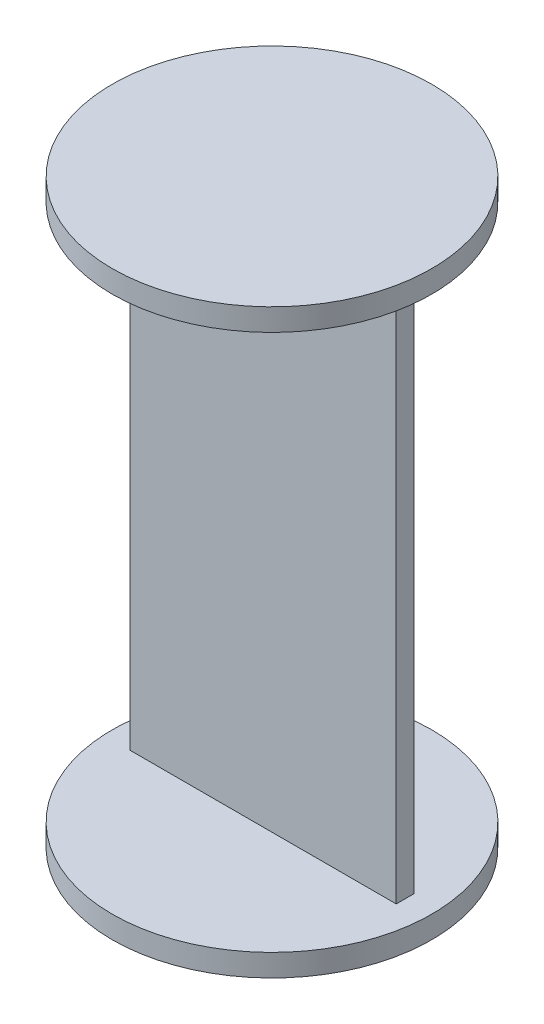
ISO-10303-21;
HEADER;
FILE_DESCRIPTION(('STEP AP214'),'2;1');
FILE_NAME('part.step','',(''),(''),'','','');
FILE_SCHEMA(('AUTOMOTIVE_DESIGN { 1 0 10303 214 1 1 1 1 }'));
ENDSEC;
DATA;
#1=APPLICATION_CONTEXT('core data for automotive mechanical design processes');
#2=APPLICATION_PROTOCOL_DEFINITION('international standard','automotive_design',2000,#1);
#3=PRODUCT_CONTEXT('',#1,'mechanical');
#4=PRODUCT('Part','Part','',(#3));
#5=PRODUCT_RELATED_PRODUCT_CATEGORY('part','',(#4));
#6=PRODUCT_DEFINITION_FORMATION('','',#4);
#7=PRODUCT_DEFINITION_CONTEXT('part definition',#1,'design');
#8=PRODUCT_DEFINITION('design','',#6,#7);
#9=PRODUCT_DEFINITION_SHAPE('','',#8);
#10=(LENGTH_UNIT() NAMED_UNIT(*) SI_UNIT(.MILLI.,.METRE.));
#11=(NAMED_UNIT(*) PLANE_ANGLE_UNIT() SI_UNIT($,.RADIAN.));
#12=(NAMED_UNIT(*) SI_UNIT($,.STERADIAN.) SOLID_ANGLE_UNIT());
#13=UNCERTAINTY_MEASURE_WITH_UNIT(LENGTH_MEASURE(1.E-05),#10,'distance_accuracy_value','');
#14=(GEOMETRIC_REPRESENTATION_CONTEXT(3) GLOBAL_UNCERTAINTY_ASSIGNED_CONTEXT((#13)) GLOBAL_UNIT_ASSIGNED_CONTEXT((#10,
#11,#12)) REPRESENTATION_CONTEXT('',''));
#15=CARTESIAN_POINT('',(0.,0.,0.));
#16=DIRECTION('',(0.,0.,1.));
#17=DIRECTION('',(1.,0.,0.));
#18=AXIS2_PLACEMENT_3D('',#15,#16,#17);
#19=CARTESIAN_POINT('',(0.,6.35,0.));
#20=DIRECTION('',(0.,1.,0.));
#21=DIRECTION('',(0.,0.,1.));
#22=AXIS2_PLACEMENT_3D('',#19,#20,#21);
#23=PLANE('',#22);
#24=CARTESIAN_POINT('',(0.,6.35,0.));
#25=DIRECTION('',(0.,1.,0.));
#26=DIRECTION('',(0.,0.,1.));
#27=AXIS2_PLACEMENT_3D('',#24,#25,#26);
#28=CIRCLE('',#27,45.72);
#29=CARTESIAN_POINT('',(0.,6.35,45.72));
#30=VERTEX_POINT('',#29);
#31=EDGE_CURVE('E11',#30,#30,#28,.T.);
#32=ORIENTED_EDGE('',*,*,#31,.T.);
#33=EDGE_LOOP('',(#32));
#34=FACE_BOUND('',#33,.T.);
#35=DIRECTION('',(1.,0.,0.));
#36=VECTOR('',#35,1.);
#37=CARTESIAN_POINT('',(-38.1,6.35,2.54));
#38=LINE('',#37,#36);
#39=CARTESIAN_POINT('',(-38.1,6.35,2.54));
#40=VERTEX_POINT('',#39);
#41=CARTESIAN_POINT('',(38.1,6.35,2.54));
#42=VERTEX_POINT('',#41);
#43=EDGE_CURVE('E112',#40,#42,#38,.T.);
#44=ORIENTED_EDGE('',*,*,#43,.F.);
#45=DIRECTION('',(0.,0.,1.));
#46=VECTOR('',#45,1.);
#47=CARTESIAN_POINT('',(-38.1,6.35,-2.54));
#48=LINE('',#47,#46);
#49=CARTESIAN_POINT('',(-38.1,6.35,-2.54));
#50=VERTEX_POINT('',#49);
#51=EDGE_CURVE('E109',#50,#40,#48,.T.);
#52=ORIENTED_EDGE('',*,*,#51,.F.);
#53=DIRECTION('',(-1.,0.,0.));
#54=VECTOR('',#53,1.);
#55=CARTESIAN_POINT('',(-38.1,6.35,-2.54));
#56=LINE('',#55,#54);
#57=CARTESIAN_POINT('',(38.1,6.35,-2.54));
#58=VERTEX_POINT('',#57);
#59=EDGE_CURVE('E75',#58,#50,#56,.T.);
#60=ORIENTED_EDGE('',*,*,#59,.F.);
#61=DIRECTION('',(0.,0.,-1.));
#62=VECTOR('',#61,1.);
#63=CARTESIAN_POINT('',(38.1,6.35,-2.54));
#64=LINE('',#63,#62);
#65=EDGE_CURVE('E116',#42,#58,#64,.T.);
#66=ORIENTED_EDGE('',*,*,#65,.F.);
#67=EDGE_LOOP('',(#44,#52,#60,#66));
#68=FACE_BOUND('',#67,.T.);
#69=ADVANCED_FACE('F39',(#34,#68),#23,.T.);
#70=CARTESIAN_POINT('',(0.,6.35,0.));
#71=DIRECTION('',(0.,-1.,0.));
#72=DIRECTION('',(0.,0.,-1.));
#73=AXIS2_PLACEMENT_3D('',#70,#71,#72);
#74=CYLINDRICAL_SURFACE('',#73,45.72);
#75=ORIENTED_EDGE('',*,*,#31,.F.);
#76=EDGE_LOOP('',(#75));
#77=FACE_BOUND('',#76,.T.);
#78=CARTESIAN_POINT('',(0.,0.,0.));
#79=DIRECTION('',(0.,1.,0.));
#80=DIRECTION('',(0.,0.,1.));
#81=AXIS2_PLACEMENT_3D('',#78,#79,#80);
#82=CIRCLE('',#81,45.72);
#83=CARTESIAN_POINT('',(0.,0.,45.72));
#84=VERTEX_POINT('',#83);
#85=EDGE_CURVE('E43',#84,#84,#82,.T.);
#86=ORIENTED_EDGE('',*,*,#85,.T.);
#87=EDGE_LOOP('',(#86));
#88=FACE_BOUND('',#87,.T.);
#89=ADVANCED_FACE('F41',(#77,#88),#74,.T.);
#90=CARTESIAN_POINT('',(0.,0.,0.));
#91=DIRECTION('',(0.,1.,0.));
#92=DIRECTION('',(0.,0.,1.));
#93=AXIS2_PLACEMENT_3D('',#90,#91,#92);
#94=PLANE('',#93);
#95=ORIENTED_EDGE('',*,*,#85,.F.);
#96=EDGE_LOOP('',(#95));
#97=FACE_BOUND('',#96,.T.);
#98=ADVANCED_FACE('F133',(#97),#94,.F.);
#99=CARTESIAN_POINT('',(-38.1,160.02,-2.54));
#100=DIRECTION('',(1.,0.,0.));
#101=DIRECTION('',(0.,0.,-1.));
#102=AXIS2_PLACEMENT_3D('',#99,#100,#101);
#103=PLANE('',#102);
#104=ORIENTED_EDGE('',*,*,#51,.T.);
#105=DIRECTION('',(0.,-1.,0.));
#106=VECTOR('',#105,1.);
#107=CARTESIAN_POINT('',(-38.1,160.02,2.54));
#108=LINE('',#107,#106);
#109=CARTESIAN_POINT('',(-38.1,160.02,2.54));
#110=VERTEX_POINT('',#109);
#111=EDGE_CURVE('E91',#110,#40,#108,.T.);
#112=ORIENTED_EDGE('',*,*,#111,.F.);
#113=DIRECTION('',(0.,0.,1.));
#114=VECTOR('',#113,1.);
#115=CARTESIAN_POINT('',(-38.1,160.02,-2.54));
#116=LINE('',#115,#114);
#117=CARTESIAN_POINT('',(-38.1,160.02,-2.54));
#118=VERTEX_POINT('',#117);
#119=EDGE_CURVE('E86',#118,#110,#116,.T.);
#120=ORIENTED_EDGE('',*,*,#119,.F.);
#121=DIRECTION('',(0.,-1.,0.));
#122=VECTOR('',#121,1.);
#123=CARTESIAN_POINT('',(-38.1,160.02,-2.54));
#124=LINE('',#123,#122);
#125=EDGE_CURVE('E89',#118,#50,#124,.T.);
#126=ORIENTED_EDGE('',*,*,#125,.T.);
#127=EDGE_LOOP('',(#104,#112,#120,#126));
#128=FACE_BOUND('',#127,.T.);
#129=ADVANCED_FACE('F88',(#128),#103,.F.);
#130=CARTESIAN_POINT('',(-38.1,160.02,2.54));
#131=DIRECTION('',(0.,0.,-1.));
#132=DIRECTION('',(-1.,0.,0.));
#133=AXIS2_PLACEMENT_3D('',#130,#131,#132);
#134=PLANE('',#133);
#135=ORIENTED_EDGE('',*,*,#43,.T.);
#136=DIRECTION('',(0.,-1.,0.));
#137=VECTOR('',#136,1.);
#138=CARTESIAN_POINT('',(38.1,160.02,2.54));
#139=LINE('',#138,#137);
#140=CARTESIAN_POINT('',(38.1,160.02,2.54));
#141=VERTEX_POINT('',#140);
#142=EDGE_CURVE('E123',#141,#42,#139,.T.);
#143=ORIENTED_EDGE('',*,*,#142,.F.);
#144=DIRECTION('',(1.,0.,0.));
#145=VECTOR('',#144,1.);
#146=CARTESIAN_POINT('',(-38.1,160.02,2.54));
#147=LINE('',#146,#145);
#148=EDGE_CURVE('E80',#110,#141,#147,.T.);
#149=ORIENTED_EDGE('',*,*,#148,.F.);
#150=ORIENTED_EDGE('',*,*,#111,.T.);
#151=EDGE_LOOP('',(#135,#143,#149,#150));
#152=FACE_BOUND('',#151,.T.);
#153=ADVANCED_FACE('F139',(#152),#134,.F.);
#154=CARTESIAN_POINT('',(38.1,160.02,-2.54));
#155=DIRECTION('',(-1.,0.,0.));
#156=DIRECTION('',(0.,0.,1.));
#157=AXIS2_PLACEMENT_3D('',#154,#155,#156);
#158=PLANE('',#157);
#159=ORIENTED_EDGE('',*,*,#65,.T.);
#160=DIRECTION('',(0.,-1.,0.));
#161=VECTOR('',#160,1.);
#162=CARTESIAN_POINT('',(38.1,160.02,-2.54));
#163=LINE('',#162,#161);
#164=CARTESIAN_POINT('',(38.1,160.02,-2.54));
#165=VERTEX_POINT('',#164);
#166=EDGE_CURVE('E55',#165,#58,#163,.T.);
#167=ORIENTED_EDGE('',*,*,#166,.F.);
#168=DIRECTION('',(0.,0.,-1.));
#169=VECTOR('',#168,1.);
#170=CARTESIAN_POINT('',(38.1,160.02,-2.54));
#171=LINE('',#170,#169);
#172=EDGE_CURVE('E102',#141,#165,#171,.T.);
#173=ORIENTED_EDGE('',*,*,#172,.F.);
#174=ORIENTED_EDGE('',*,*,#142,.T.);
#175=EDGE_LOOP('',(#159,#167,#173,#174));
#176=FACE_BOUND('',#175,.T.);
#177=ADVANCED_FACE('F151',(#176),#158,.F.);
#178=CARTESIAN_POINT('',(-38.1,160.02,-2.54));
#179=DIRECTION('',(0.,0.,1.));
#180=DIRECTION('',(1.,0.,0.));
#181=AXIS2_PLACEMENT_3D('',#178,#179,#180);
#182=PLANE('',#181);
#183=ORIENTED_EDGE('',*,*,#59,.T.);
#184=ORIENTED_EDGE('',*,*,#125,.F.);
#185=DIRECTION('',(-1.,0.,0.));
#186=VECTOR('',#185,1.);
#187=CARTESIAN_POINT('',(-38.1,160.02,-2.54));
#188=LINE('',#187,#186);
#189=EDGE_CURVE('E97',#165,#118,#188,.T.);
#190=ORIENTED_EDGE('',*,*,#189,.F.);
#191=ORIENTED_EDGE('',*,*,#166,.T.);
#192=EDGE_LOOP('',(#183,#184,#190,#191));
#193=FACE_BOUND('',#192,.T.);
#194=ADVANCED_FACE('F96',(#193),#182,.F.);
#195=CARTESIAN_POINT('',(0.,160.02,0.));
#196=DIRECTION('',(0.,1.,0.));
#197=DIRECTION('',(0.,0.,1.));
#198=AXIS2_PLACEMENT_3D('',#195,#196,#197);
#199=PLANE('',#198);
#200=CARTESIAN_POINT('',(0.,160.02,0.));
#201=DIRECTION('',(0.,1.,0.));
#202=DIRECTION('',(0.,0.,1.));
#203=AXIS2_PLACEMENT_3D('',#200,#201,#202);
#204=CIRCLE('',#203,45.72);
#205=CARTESIAN_POINT('',(0.,160.02,45.72));
#206=VERTEX_POINT('',#205);
#207=EDGE_CURVE('E171',#206,#206,#204,.T.);
#208=ORIENTED_EDGE('',*,*,#207,.F.);
#209=EDGE_LOOP('',(#208));
#210=FACE_BOUND('',#209,.T.);
#211=ORIENTED_EDGE('',*,*,#189,.T.);
#212=ORIENTED_EDGE('',*,*,#119,.T.);
#213=ORIENTED_EDGE('',*,*,#148,.T.);
#214=ORIENTED_EDGE('',*,*,#172,.T.);
#215=EDGE_LOOP('',(#211,#212,#213,#214));
#216=FACE_BOUND('',#215,.T.);
#217=ADVANCED_FACE('F101',(#210,#216),#199,.F.);
#218=CARTESIAN_POINT('',(0.,166.37,0.));
#219=DIRECTION('',(0.,-1.,0.));
#220=DIRECTION('',(0.,0.,-1.));
#221=AXIS2_PLACEMENT_3D('',#218,#219,#220);
#222=CYLINDRICAL_SURFACE('',#221,45.72);
#223=CARTESIAN_POINT('',(0.,166.37,0.));
#224=DIRECTION('',(0.,1.,0.));
#225=DIRECTION('',(0.,0.,1.));
#226=AXIS2_PLACEMENT_3D('',#223,#224,#225);
#227=CIRCLE('',#226,45.72);
#228=CARTESIAN_POINT('',(0.,166.37,45.72));
#229=VERTEX_POINT('',#228);
#230=EDGE_CURVE('E113',#229,#229,#227,.T.);
#231=ORIENTED_EDGE('',*,*,#230,.F.);
#232=EDGE_LOOP('',(#231));
#233=FACE_BOUND('',#232,.T.);
#234=ORIENTED_EDGE('',*,*,#207,.T.);
#235=EDGE_LOOP('',(#234));
#236=FACE_BOUND('',#235,.T.);
#237=ADVANCED_FACE('F156',(#233,#236),#222,.T.);
#238=CARTESIAN_POINT('',(0.,166.37,0.));
#239=DIRECTION('',(0.,1.,0.));
#240=DIRECTION('',(0.,0.,1.));
#241=AXIS2_PLACEMENT_3D('',#238,#239,#240);
#242=PLANE('',#241);
#243=ORIENTED_EDGE('',*,*,#230,.T.);
#244=EDGE_LOOP('',(#243));
#245=FACE_BOUND('',#244,.T.);
#246=ADVANCED_FACE('F159',(#245),#242,.T.);
#247=CLOSED_SHELL('',(#69,#89,#98,#129,#153,#177,#194,#217,#237,#246));
#248=MANIFOLD_SOLID_BREP('B2',#247);
#249=ADVANCED_BREP_SHAPE_REPRESENTATION('',(#18,#248),#14);
#250=SHAPE_DEFINITION_REPRESENTATION(#9,#249);
ENDSEC;
END-ISO-10303-21;
